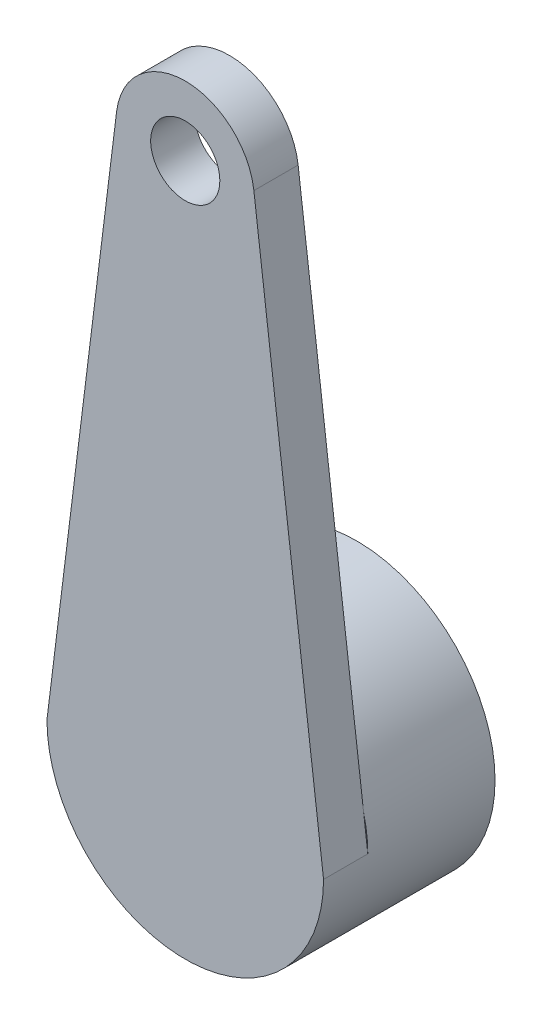
ISO-10303-21;
HEADER;
FILE_DESCRIPTION(('STEP AP214'),'2;1');
FILE_NAME('part.step','',(''),(''),'','','');
FILE_SCHEMA(('AUTOMOTIVE_DESIGN { 1 0 10303 214 1 1 1 1 }'));
ENDSEC;
DATA;
#1=APPLICATION_CONTEXT('core data for automotive mechanical design processes');
#2=APPLICATION_PROTOCOL_DEFINITION('international standard','automotive_design',2000,#1);
#3=PRODUCT_CONTEXT('',#1,'mechanical');
#4=PRODUCT('Part','Part','',(#3));
#5=PRODUCT_RELATED_PRODUCT_CATEGORY('part','',(#4));
#6=PRODUCT_DEFINITION_FORMATION('','',#4);
#7=PRODUCT_DEFINITION_CONTEXT('part definition',#1,'design');
#8=PRODUCT_DEFINITION('design','',#6,#7);
#9=PRODUCT_DEFINITION_SHAPE('','',#8);
#10=(LENGTH_UNIT() NAMED_UNIT(*) SI_UNIT(.MILLI.,.METRE.));
#11=(NAMED_UNIT(*) PLANE_ANGLE_UNIT() SI_UNIT($,.RADIAN.));
#12=(NAMED_UNIT(*) SI_UNIT($,.STERADIAN.) SOLID_ANGLE_UNIT());
#13=UNCERTAINTY_MEASURE_WITH_UNIT(LENGTH_MEASURE(1.E-05),#10,'distance_accuracy_value','');
#14=(GEOMETRIC_REPRESENTATION_CONTEXT(3) GLOBAL_UNCERTAINTY_ASSIGNED_CONTEXT((#13)) GLOBAL_UNIT_ASSIGNED_CONTEXT((#10,
#11,#12)) REPRESENTATION_CONTEXT('',''));
#15=CARTESIAN_POINT('',(0.,0.,0.));
#16=DIRECTION('',(0.,0.,1.));
#17=DIRECTION('',(1.,0.,0.));
#18=AXIS2_PLACEMENT_3D('',#15,#16,#17);
#19=CARTESIAN_POINT('',(6780.77584034497,3542.56813978667,5.842));
#20=DIRECTION('',(0.,0.,1.));
#21=DIRECTION('',(1.,0.,0.));
#22=AXIS2_PLACEMENT_3D('',#19,#20,#21);
#23=PLANE('',#22);
#24=DIRECTION('',(-0.123098610937427,-0.9923944437497,0.));
#25=VECTOR('',#24,1.);
#26=CARTESIAN_POINT('',(6774.42584034497,3542.56813978666,5.842));
#27=LINE('',#26,#25);
#28=CARTESIAN_POINT('',(6774.61828684876,3544.11960198127,5.842));
#29=VERTEX_POINT('',#28);
#30=CARTESIAN_POINT('',(6774.42584034497,3542.56813978666,5.842));
#31=VERTEX_POINT('',#30);
#32=EDGE_CURVE('E11',#29,#31,#27,.T.);
#33=ORIENTED_EDGE('',*,*,#32,.F.);
#34=CARTESIAN_POINT('',(6780.77584034497,3542.56813978667,5.842));
#35=DIRECTION('',(0.,0.,1.));
#36=DIRECTION('',(1.,0.,0.));
#37=AXIS2_PLACEMENT_3D('',#34,#35,#36);
#38=CIRCLE('',#37,6.3500000000003);
#39=EDGE_CURVE('E49',#29,#31,#38,.T.);
#40=ORIENTED_EDGE('',*,*,#39,.T.);
#41=EDGE_LOOP('',(#33,#40));
#42=FACE_BOUND('',#41,.T.);
#43=ADVANCED_FACE('F33',(#42),#23,.T.);
#44=DIRECTION('',(-0.123098610937393,0.992394443749704,0.));
#45=VECTOR('',#44,1.);
#46=CARTESIAN_POINT('',(6787.12584034497,3542.56813978666,5.842));
#47=LINE('',#46,#45);
#48=CARTESIAN_POINT('',(6787.12584034497,3542.56813978665,5.842));
#49=VERTEX_POINT('',#48);
#50=CARTESIAN_POINT('',(6786.93339384118,3544.11960198128,5.842));
#51=VERTEX_POINT('',#50);
#52=EDGE_CURVE('E112',#49,#51,#47,.T.);
#53=ORIENTED_EDGE('',*,*,#52,.F.);
#54=EDGE_CURVE('E42',#49,#51,#38,.T.);
#55=ORIENTED_EDGE('',*,*,#54,.T.);
#56=EDGE_LOOP('',(#53,#55));
#57=FACE_BOUND('',#56,.T.);
#58=ADVANCED_FACE('F160',(#57),#23,.T.);
#59=CARTESIAN_POINT('',(6780.77584034497,3542.56813978667,0.));
#60=DIRECTION('',(0.,0.,1.));
#61=DIRECTION('',(1.,0.,0.));
#62=AXIS2_PLACEMENT_3D('',#59,#60,#61);
#63=PLANE('',#62);
#64=CARTESIAN_POINT('',(6780.77584034497,3542.56813978667,0.));
#65=DIRECTION('',(0.,0.,1.));
#66=DIRECTION('',(1.,0.,0.));
#67=AXIS2_PLACEMENT_3D('',#64,#65,#66);
#68=CIRCLE('',#67,6.3500000000003);
#69=CARTESIAN_POINT('',(6787.12584034497,3542.56813978667,0.));
#70=VERTEX_POINT('',#69);
#71=EDGE_CURVE('E132',#70,#70,#68,.T.);
#72=ORIENTED_EDGE('',*,*,#71,.F.);
#73=EDGE_LOOP('',(#72));
#74=FACE_BOUND('',#73,.T.);
#75=CARTESIAN_POINT('',(6780.77584034497,3542.56813978667,0.));
#76=DIRECTION('',(0.,0.,1.));
#77=DIRECTION('',(1.,0.,0.));
#78=AXIS2_PLACEMENT_3D('',#75,#76,#77);
#79=CIRCLE('',#78,4.06399999999962);
#80=CARTESIAN_POINT('',(6784.83984034497,3542.56813978667,0.));
#81=VERTEX_POINT('',#80);
#82=EDGE_CURVE('E106',#81,#81,#79,.T.);
#83=ORIENTED_EDGE('',*,*,#82,.T.);
#84=EDGE_LOOP('',(#83));
#85=FACE_BOUND('',#84,.T.);
#86=ADVANCED_FACE('F143',(#74,#85),#63,.F.);
#87=CARTESIAN_POINT('',(6780.77584034497,3542.56813978667,5.842));
#88=DIRECTION('',(0.,0.,-1.));
#89=DIRECTION('',(-1.,0.,0.));
#90=AXIS2_PLACEMENT_3D('',#87,#88,#89);
#91=CYLINDRICAL_SURFACE('',#90,6.3500000000003);
#92=ORIENTED_EDGE('',*,*,#54,.F.);
#93=DIRECTION('',(0.,0.,-1.));
#94=VECTOR('',#93,1.);
#95=CARTESIAN_POINT('',(6787.12584034497,3542.56813978666,7.874));
#96=LINE('',#95,#94);
#97=CARTESIAN_POINT('',(6787.12584034497,3542.56813978666,7.874));
#98=VERTEX_POINT('',#97);
#99=EDGE_CURVE('E82',#98,#49,#96,.T.);
#100=ORIENTED_EDGE('',*,*,#99,.F.);
#101=CARTESIAN_POINT('',(6780.77584034497,3542.56813978667,7.874));
#102=DIRECTION('',(0.,0.,1.));
#103=DIRECTION('',(1.,0.,0.));
#104=AXIS2_PLACEMENT_3D('',#101,#102,#103);
#105=CIRCLE('',#104,6.34999999999986);
#106=CARTESIAN_POINT('',(6774.42584034497,3542.56813978666,7.874));
#107=VERTEX_POINT('',#106);
#108=EDGE_CURVE('E88',#107,#98,#105,.T.);
#109=ORIENTED_EDGE('',*,*,#108,.F.);
#110=DIRECTION('',(0.,0.,-1.));
#111=VECTOR('',#110,1.);
#112=CARTESIAN_POINT('',(6774.42584034497,3542.56813978666,7.874));
#113=LINE('',#112,#111);
#114=EDGE_CURVE('E115',#107,#31,#113,.T.);
#115=ORIENTED_EDGE('',*,*,#114,.T.);
#116=ORIENTED_EDGE('',*,*,#39,.F.);
#117=EDGE_CURVE('E131',#51,#29,#38,.T.);
#118=ORIENTED_EDGE('',*,*,#117,.F.);
#119=EDGE_LOOP('',(#92,#100,#109,#115,#116,#118));
#120=FACE_BOUND('',#119,.T.);
#121=ORIENTED_EDGE('',*,*,#71,.T.);
#122=EDGE_LOOP('',(#121));
#123=FACE_BOUND('',#122,.T.);
#124=ADVANCED_FACE('F35',(#120,#123),#91,.T.);
#125=CARTESIAN_POINT('',(6780.77584034497,3542.56813978667,5.842));
#126=DIRECTION('',(0.,0.,-1.));
#127=DIRECTION('',(-1.,0.,0.));
#128=AXIS2_PLACEMENT_3D('',#125,#126,#127);
#129=CYLINDRICAL_SURFACE('',#128,4.06399999999962);
#130=CARTESIAN_POINT('',(6780.77584034497,3542.56813978667,5.842));
#131=DIRECTION('',(0.,0.,1.));
#132=DIRECTION('',(1.,0.,0.));
#133=AXIS2_PLACEMENT_3D('',#130,#131,#132);
#134=CIRCLE('',#133,4.06399999999962);
#135=CARTESIAN_POINT('',(6784.83984034497,3542.56813978667,5.842));
#136=VERTEX_POINT('',#135);
#137=EDGE_CURVE('E103',#136,#136,#134,.T.);
#138=ORIENTED_EDGE('',*,*,#137,.T.);
#139=EDGE_LOOP('',(#138));
#140=FACE_BOUND('',#139,.T.);
#141=ORIENTED_EDGE('',*,*,#82,.F.);
#142=EDGE_LOOP('',(#141));
#143=FACE_BOUND('',#142,.T.);
#144=ADVANCED_FACE('F145',(#140,#143),#129,.F.);
#145=CARTESIAN_POINT('',(6780.77584034497,3567.96813978666,7.874));
#146=DIRECTION('',(0.,0.,-1.));
#147=DIRECTION('',(-1.,0.,0.));
#148=AXIS2_PLACEMENT_3D('',#145,#146,#147);
#149=CYLINDRICAL_SURFACE('',#148,1.5875000000003);
#150=CARTESIAN_POINT('',(6780.77584034497,3567.96813978666,7.874));
#151=DIRECTION('',(0.,0.,1.));
#152=DIRECTION('',(1.,0.,0.));
#153=AXIS2_PLACEMENT_3D('',#150,#151,#152);
#154=CIRCLE('',#153,1.5875000000003);
#155=CARTESIAN_POINT('',(6782.36334034497,3567.96813978666,7.874));
#156=VERTEX_POINT('',#155);
#157=EDGE_CURVE('E123',#156,#156,#154,.T.);
#158=ORIENTED_EDGE('',*,*,#157,.T.);
#159=EDGE_LOOP('',(#158));
#160=FACE_BOUND('',#159,.T.);
#161=CARTESIAN_POINT('',(6780.77584034497,3567.96813978666,5.842));
#162=DIRECTION('',(0.,0.,1.));
#163=DIRECTION('',(1.,0.,0.));
#164=AXIS2_PLACEMENT_3D('',#161,#162,#163);
#165=CIRCLE('',#164,1.5875000000003);
#166=CARTESIAN_POINT('',(6782.36334034497,3567.96813978666,5.842));
#167=VERTEX_POINT('',#166);
#168=EDGE_CURVE('E247',#167,#167,#165,.T.);
#169=ORIENTED_EDGE('',*,*,#168,.F.);
#170=EDGE_LOOP('',(#169));
#171=FACE_BOUND('',#170,.T.);
#172=ADVANCED_FACE('F147',(#160,#171),#149,.F.);
#173=CARTESIAN_POINT('',(6774.42584034497,3542.56813978666,7.874));
#174=DIRECTION('',(0.9923944437497,-0.123098610937427,0.));
#175=DIRECTION('',(0.123098610937427,0.9923944437497,0.));
#176=AXIS2_PLACEMENT_3D('',#173,#174,#175);
#177=PLANE('',#176);
#178=CARTESIAN_POINT('',(6777.62498798607,3568.35897787639,5.842));
#179=VERTEX_POINT('',#178);
#180=EDGE_CURVE('E98',#179,#29,#27,.T.);
#181=ORIENTED_EDGE('',*,*,#180,.T.);
#182=ORIENTED_EDGE('',*,*,#32,.T.);
#183=ORIENTED_EDGE('',*,*,#114,.F.);
#184=DIRECTION('',(-0.123098610937427,-0.9923944437497,0.));
#185=VECTOR('',#184,1.);
#186=CARTESIAN_POINT('',(6774.42584034497,3542.56813978666,7.874));
#187=LINE('',#186,#185);
#188=CARTESIAN_POINT('',(6777.62498798607,3568.35897787639,7.874));
#189=VERTEX_POINT('',#188);
#190=EDGE_CURVE('E94',#189,#107,#187,.T.);
#191=ORIENTED_EDGE('',*,*,#190,.F.);
#192=DIRECTION('',(0.,0.,-1.));
#193=VECTOR('',#192,1.);
#194=CARTESIAN_POINT('',(6777.62498798607,3568.35897787639,7.874));
#195=LINE('',#194,#193);
#196=EDGE_CURVE('E108',#189,#179,#195,.T.);
#197=ORIENTED_EDGE('',*,*,#196,.T.);
#198=EDGE_LOOP('',(#181,#182,#183,#191,#197));
#199=FACE_BOUND('',#198,.T.);
#200=ADVANCED_FACE('F154',(#199),#177,.F.);
#201=CARTESIAN_POINT('',(6780.77584034497,3567.96813978666,7.874));
#202=DIRECTION('',(0.,0.,-1.));
#203=DIRECTION('',(-1.,0.,0.));
#204=AXIS2_PLACEMENT_3D('',#201,#202,#203);
#205=CYLINDRICAL_SURFACE('',#204,3.17499999999971);
#206=CARTESIAN_POINT('',(6780.77584034497,3567.96813978666,5.842));
#207=DIRECTION('',(0.,0.,1.));
#208=DIRECTION('',(1.,0.,0.));
#209=AXIS2_PLACEMENT_3D('',#206,#207,#208);
#210=CIRCLE('',#209,3.17499999999971);
#211=CARTESIAN_POINT('',(6783.92669270388,3568.35897787639,5.842));
#212=VERTEX_POINT('',#211);
#213=EDGE_CURVE('E124',#212,#179,#210,.T.);
#214=ORIENTED_EDGE('',*,*,#213,.T.);
#215=ORIENTED_EDGE('',*,*,#196,.F.);
#216=CARTESIAN_POINT('',(6780.77584034497,3567.96813978666,7.874));
#217=DIRECTION('',(0.,0.,1.));
#218=DIRECTION('',(1.,0.,0.));
#219=AXIS2_PLACEMENT_3D('',#216,#217,#218);
#220=CIRCLE('',#219,3.17499999999971);
#221=CARTESIAN_POINT('',(6783.92669270388,3568.35897787639,7.874));
#222=VERTEX_POINT('',#221);
#223=EDGE_CURVE('E87',#222,#189,#220,.T.);
#224=ORIENTED_EDGE('',*,*,#223,.F.);
#225=DIRECTION('',(0.,0.,-1.));
#226=VECTOR('',#225,1.);
#227=CARTESIAN_POINT('',(6783.92669270388,3568.35897787639,7.874));
#228=LINE('',#227,#226);
#229=EDGE_CURVE('E84',#222,#212,#228,.T.);
#230=ORIENTED_EDGE('',*,*,#229,.T.);
#231=EDGE_LOOP('',(#214,#215,#224,#230));
#232=FACE_BOUND('',#231,.T.);
#233=ADVANCED_FACE('F195',(#232),#205,.T.);
#234=CARTESIAN_POINT('',(6787.12584034497,3542.56813978666,7.874));
#235=DIRECTION('',(-0.992394443749704,-0.123098610937393,0.));
#236=DIRECTION('',(0.123098610937393,-0.992394443749704,0.));
#237=AXIS2_PLACEMENT_3D('',#234,#235,#236);
#238=PLANE('',#237);
#239=ORIENTED_EDGE('',*,*,#52,.T.);
#240=EDGE_CURVE('E120',#51,#212,#47,.T.);
#241=ORIENTED_EDGE('',*,*,#240,.T.);
#242=ORIENTED_EDGE('',*,*,#229,.F.);
#243=DIRECTION('',(-0.123098610937393,0.992394443749704,0.));
#244=VECTOR('',#243,1.);
#245=CARTESIAN_POINT('',(6787.12584034497,3542.56813978666,7.874));
#246=LINE('',#245,#244);
#247=EDGE_CURVE('E77',#98,#222,#246,.T.);
#248=ORIENTED_EDGE('',*,*,#247,.F.);
#249=ORIENTED_EDGE('',*,*,#99,.T.);
#250=EDGE_LOOP('',(#239,#241,#242,#248,#249));
#251=FACE_BOUND('',#250,.T.);
#252=ADVANCED_FACE('F80',(#251),#238,.F.);
#253=CARTESIAN_POINT('',(6780.77584034497,3542.56813978667,7.874));
#254=DIRECTION('',(0.,0.,1.));
#255=DIRECTION('',(1.,0.,0.));
#256=AXIS2_PLACEMENT_3D('',#253,#254,#255);
#257=PLANE('',#256);
#258=ORIENTED_EDGE('',*,*,#108,.T.);
#259=ORIENTED_EDGE('',*,*,#247,.T.);
#260=ORIENTED_EDGE('',*,*,#223,.T.);
#261=ORIENTED_EDGE('',*,*,#190,.T.);
#262=EDGE_LOOP('',(#258,#259,#260,#261));
#263=FACE_BOUND('',#262,.T.);
#264=ORIENTED_EDGE('',*,*,#157,.F.);
#265=EDGE_LOOP('',(#264));
#266=FACE_BOUND('',#265,.T.);
#267=ADVANCED_FACE('F91',(#263,#266),#257,.T.);
#268=CARTESIAN_POINT('',(6780.77584034497,3542.56813978667,5.842));
#269=DIRECTION('',(0.,0.,1.));
#270=DIRECTION('',(1.,0.,0.));
#271=AXIS2_PLACEMENT_3D('',#268,#269,#270);
#272=PLANE('',#271);
#273=ORIENTED_EDGE('',*,*,#168,.T.);
#274=EDGE_LOOP('',(#273));
#275=FACE_BOUND('',#274,.T.);
#276=ORIENTED_EDGE('',*,*,#240,.F.);
#277=ORIENTED_EDGE('',*,*,#117,.T.);
#278=ORIENTED_EDGE('',*,*,#180,.F.);
#279=ORIENTED_EDGE('',*,*,#213,.F.);
#280=EDGE_LOOP('',(#276,#277,#278,#279));
#281=FACE_BOUND('',#280,.T.);
#282=ADVANCED_FACE('F221',(#275,#281),#272,.F.);
#283=ORIENTED_EDGE('',*,*,#137,.F.);
#284=EDGE_LOOP('',(#283));
#285=FACE_BOUND('',#284,.T.);
#286=ADVANCED_FACE('F230',(#285),#272,.F.);
#287=CLOSED_SHELL('',(#43,#58,#86,#124,#144,#172,#200,#233,#252,#267,#282,#286));
#288=MANIFOLD_SOLID_BREP('B2',#287);
#289=ADVANCED_BREP_SHAPE_REPRESENTATION('',(#18,#288),#14);
#290=SHAPE_DEFINITION_REPRESENTATION(#9,#289);
ENDSEC;
END-ISO-10303-21;
